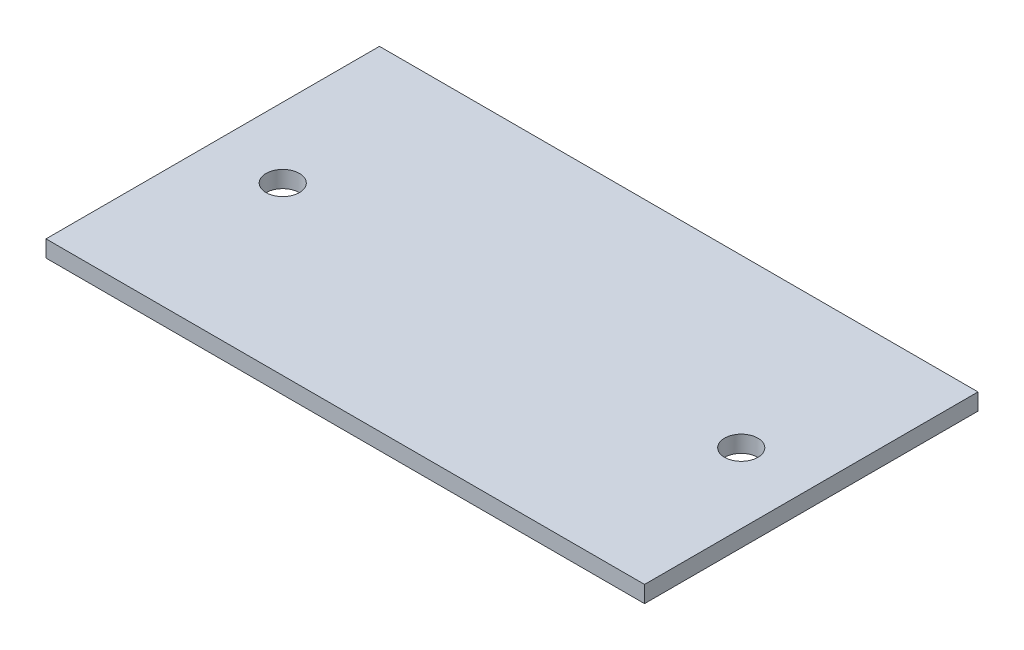
ISO-10303-21;
HEADER;
FILE_DESCRIPTION(('STEP AP214'),'2;1');
FILE_NAME('part.step','',(''),(''),'','','');
FILE_SCHEMA(('AUTOMOTIVE_DESIGN { 1 0 10303 214 1 1 1 1 }'));
ENDSEC;
DATA;
#1=APPLICATION_CONTEXT('core data for automotive mechanical design processes');
#2=APPLICATION_PROTOCOL_DEFINITION('international standard','automotive_design',2000,#1);
#3=PRODUCT_CONTEXT('',#1,'mechanical');
#4=PRODUCT('Part','Part','',(#3));
#5=PRODUCT_RELATED_PRODUCT_CATEGORY('part','',(#4));
#6=PRODUCT_DEFINITION_FORMATION('','',#4);
#7=PRODUCT_DEFINITION_CONTEXT('part definition',#1,'design');
#8=PRODUCT_DEFINITION('design','',#6,#7);
#9=PRODUCT_DEFINITION_SHAPE('','',#8);
#10=(LENGTH_UNIT() NAMED_UNIT(*) SI_UNIT(.MILLI.,.METRE.));
#11=(NAMED_UNIT(*) PLANE_ANGLE_UNIT() SI_UNIT($,.RADIAN.));
#12=(NAMED_UNIT(*) SI_UNIT($,.STERADIAN.) SOLID_ANGLE_UNIT());
#13=UNCERTAINTY_MEASURE_WITH_UNIT(LENGTH_MEASURE(1.E-05),#10,'distance_accuracy_value','');
#14=(GEOMETRIC_REPRESENTATION_CONTEXT(3) GLOBAL_UNCERTAINTY_ASSIGNED_CONTEXT((#13)) GLOBAL_UNIT_ASSIGNED_CONTEXT((#10,
#11,#12)) REPRESENTATION_CONTEXT('',''));
#15=CARTESIAN_POINT('',(0.,0.,0.));
#16=DIRECTION('',(0.,0.,1.));
#17=DIRECTION('',(1.,0.,0.));
#18=AXIS2_PLACEMENT_3D('',#15,#16,#17);
#19=CARTESIAN_POINT('',(17.95,1.,10.));
#20=DIRECTION('',(-1.,0.,0.));
#21=DIRECTION('',(0.,0.,1.));
#22=AXIS2_PLACEMENT_3D('',#19,#20,#21);
#23=PLANE('',#22);
#24=DIRECTION('',(0.,0.,-1.));
#25=VECTOR('',#24,1.);
#26=CARTESIAN_POINT('',(17.95,0.,10.));
#27=LINE('',#26,#25);
#28=CARTESIAN_POINT('',(17.95,0.,10.));
#29=VERTEX_POINT('',#28);
#30=CARTESIAN_POINT('',(17.95,0.,-10.));
#31=VERTEX_POINT('',#30);
#32=EDGE_CURVE('E98',#29,#31,#27,.T.);
#33=ORIENTED_EDGE('',*,*,#32,.T.);
#34=DIRECTION('',(0.,-1.,0.));
#35=VECTOR('',#34,1.);
#36=CARTESIAN_POINT('',(17.95,1.,-10.));
#37=LINE('',#36,#35);
#38=CARTESIAN_POINT('',(17.95,1.,-10.));
#39=VERTEX_POINT('',#38);
#40=EDGE_CURVE('E11',#39,#31,#37,.T.);
#41=ORIENTED_EDGE('',*,*,#40,.F.);
#42=DIRECTION('',(0.,0.,-1.));
#43=VECTOR('',#42,1.);
#44=CARTESIAN_POINT('',(17.95,1.,10.));
#45=LINE('',#44,#43);
#46=CARTESIAN_POINT('',(17.95,1.,10.));
#47=VERTEX_POINT('',#46);
#48=EDGE_CURVE('E86',#47,#39,#45,.T.);
#49=ORIENTED_EDGE('',*,*,#48,.F.);
#50=DIRECTION('',(0.,-1.,0.));
#51=VECTOR('',#50,1.);
#52=CARTESIAN_POINT('',(17.95,1.,10.));
#53=LINE('',#52,#51);
#54=EDGE_CURVE('E94',#47,#29,#53,.T.);
#55=ORIENTED_EDGE('',*,*,#54,.T.);
#56=EDGE_LOOP('',(#33,#41,#49,#55));
#57=FACE_BOUND('',#56,.T.);
#58=ADVANCED_FACE('F35',(#57),#23,.F.);
#59=CARTESIAN_POINT('',(-17.95,1.,-10.));
#60=DIRECTION('',(0.,0.,1.));
#61=DIRECTION('',(1.,0.,0.));
#62=AXIS2_PLACEMENT_3D('',#59,#60,#61);
#63=PLANE('',#62);
#64=DIRECTION('',(-1.,0.,0.));
#65=VECTOR('',#64,1.);
#66=CARTESIAN_POINT('',(-17.95,0.,-10.));
#67=LINE('',#66,#65);
#68=CARTESIAN_POINT('',(-17.95,0.,-10.));
#69=VERTEX_POINT('',#68);
#70=EDGE_CURVE('E90',#31,#69,#67,.T.);
#71=ORIENTED_EDGE('',*,*,#70,.T.);
#72=DIRECTION('',(0.,-1.,0.));
#73=VECTOR('',#72,1.);
#74=CARTESIAN_POINT('',(-17.95,1.,-10.));
#75=LINE('',#74,#73);
#76=CARTESIAN_POINT('',(-17.95,1.,-10.));
#77=VERTEX_POINT('',#76);
#78=EDGE_CURVE('E43',#77,#69,#75,.T.);
#79=ORIENTED_EDGE('',*,*,#78,.F.);
#80=DIRECTION('',(-1.,0.,0.));
#81=VECTOR('',#80,1.);
#82=CARTESIAN_POINT('',(-17.95,1.,-10.));
#83=LINE('',#82,#81);
#84=EDGE_CURVE('E81',#39,#77,#83,.T.);
#85=ORIENTED_EDGE('',*,*,#84,.F.);
#86=ORIENTED_EDGE('',*,*,#40,.T.);
#87=EDGE_LOOP('',(#71,#79,#85,#86));
#88=FACE_BOUND('',#87,.T.);
#89=ADVANCED_FACE('F89',(#88),#63,.F.);
#90=CARTESIAN_POINT('',(-17.95,1.,10.));
#91=DIRECTION('',(1.,0.,0.));
#92=DIRECTION('',(0.,0.,-1.));
#93=AXIS2_PLACEMENT_3D('',#90,#91,#92);
#94=PLANE('',#93);
#95=DIRECTION('',(0.,0.,1.));
#96=VECTOR('',#95,1.);
#97=CARTESIAN_POINT('',(-17.95,0.,10.));
#98=LINE('',#97,#96);
#99=CARTESIAN_POINT('',(-17.95,0.,10.));
#100=VERTEX_POINT('',#99);
#101=EDGE_CURVE('E68',#69,#100,#98,.T.);
#102=ORIENTED_EDGE('',*,*,#101,.T.);
#103=DIRECTION('',(0.,-1.,0.));
#104=VECTOR('',#103,1.);
#105=CARTESIAN_POINT('',(-17.95,1.,10.));
#106=LINE('',#105,#104);
#107=CARTESIAN_POINT('',(-17.95,1.,10.));
#108=VERTEX_POINT('',#107);
#109=EDGE_CURVE('E91',#108,#100,#106,.T.);
#110=ORIENTED_EDGE('',*,*,#109,.F.);
#111=DIRECTION('',(0.,0.,1.));
#112=VECTOR('',#111,1.);
#113=CARTESIAN_POINT('',(-17.95,1.,10.));
#114=LINE('',#113,#112);
#115=EDGE_CURVE('E84',#77,#108,#114,.T.);
#116=ORIENTED_EDGE('',*,*,#115,.F.);
#117=ORIENTED_EDGE('',*,*,#78,.T.);
#118=EDGE_LOOP('',(#102,#110,#116,#117));
#119=FACE_BOUND('',#118,.T.);
#120=ADVANCED_FACE('F92',(#119),#94,.F.);
#121=CARTESIAN_POINT('',(-17.95,1.,10.));
#122=DIRECTION('',(0.,0.,-1.));
#123=DIRECTION('',(-1.,0.,0.));
#124=AXIS2_PLACEMENT_3D('',#121,#122,#123);
#125=PLANE('',#124);
#126=DIRECTION('',(1.,0.,0.));
#127=VECTOR('',#126,1.);
#128=CARTESIAN_POINT('',(-17.95,0.,10.));
#129=LINE('',#128,#127);
#130=EDGE_CURVE('E74',#100,#29,#129,.T.);
#131=ORIENTED_EDGE('',*,*,#130,.T.);
#132=ORIENTED_EDGE('',*,*,#54,.F.);
#133=DIRECTION('',(1.,0.,0.));
#134=VECTOR('',#133,1.);
#135=CARTESIAN_POINT('',(-17.95,1.,10.));
#136=LINE('',#135,#134);
#137=EDGE_CURVE('E51',#108,#47,#136,.T.);
#138=ORIENTED_EDGE('',*,*,#137,.F.);
#139=ORIENTED_EDGE('',*,*,#109,.T.);
#140=EDGE_LOOP('',(#131,#132,#138,#139));
#141=FACE_BOUND('',#140,.T.);
#142=ADVANCED_FACE('F106',(#141),#125,.F.);
#143=CARTESIAN_POINT('',(0.,1.,0.));
#144=DIRECTION('',(0.,-1.,0.));
#145=DIRECTION('',(0.,0.,-1.));
#146=AXIS2_PLACEMENT_3D('',#143,#144,#145);
#147=PLANE('',#146);
#148=CARTESIAN_POINT('',(-13.75,1.,0.));
#149=DIRECTION('',(0.,1.,0.));
#150=DIRECTION('',(0.,0.,1.));
#151=AXIS2_PLACEMENT_3D('',#148,#149,#150);
#152=CIRCLE('',#151,1.);
#153=CARTESIAN_POINT('',(-13.75,1.,1.));
#154=VERTEX_POINT('',#153);
#155=EDGE_CURVE('E115',#154,#154,#152,.T.);
#156=ORIENTED_EDGE('',*,*,#155,.F.);
#157=EDGE_LOOP('',(#156));
#158=FACE_BOUND('',#157,.T.);
#159=CARTESIAN_POINT('',(13.75,1.,0.));
#160=DIRECTION('',(0.,1.,0.));
#161=DIRECTION('',(0.,0.,1.));
#162=AXIS2_PLACEMENT_3D('',#159,#160,#161);
#163=CIRCLE('',#162,1.);
#164=CARTESIAN_POINT('',(13.75,1.,1.));
#165=VERTEX_POINT('',#164);
#166=EDGE_CURVE('E101',#165,#165,#163,.T.);
#167=ORIENTED_EDGE('',*,*,#166,.F.);
#168=EDGE_LOOP('',(#167));
#169=FACE_BOUND('',#168,.T.);
#170=ORIENTED_EDGE('',*,*,#48,.T.);
#171=ORIENTED_EDGE('',*,*,#84,.T.);
#172=ORIENTED_EDGE('',*,*,#115,.T.);
#173=ORIENTED_EDGE('',*,*,#137,.T.);
#174=EDGE_LOOP('',(#170,#171,#172,#173));
#175=FACE_BOUND('',#174,.T.);
#176=ADVANCED_FACE('F82',(#158,#169,#175),#147,.F.);
#177=CARTESIAN_POINT('',(0.,0.,0.));
#178=DIRECTION('',(0.,-1.,0.));
#179=DIRECTION('',(0.,0.,-1.));
#180=AXIS2_PLACEMENT_3D('',#177,#178,#179);
#181=PLANE('',#180);
#182=CARTESIAN_POINT('',(-13.75,0.,0.));
#183=DIRECTION('',(0.,-1.,0.));
#184=DIRECTION('',(0.,0.,-1.));
#185=AXIS2_PLACEMENT_3D('',#182,#183,#184);
#186=CIRCLE('',#185,1.);
#187=CARTESIAN_POINT('',(-13.75,0.,-1.));
#188=VERTEX_POINT('',#187);
#189=EDGE_CURVE('E118',#188,#188,#186,.F.);
#190=ORIENTED_EDGE('',*,*,#189,.T.);
#191=EDGE_LOOP('',(#190));
#192=FACE_BOUND('',#191,.T.);
#193=CARTESIAN_POINT('',(13.75,0.,0.));
#194=DIRECTION('',(0.,-1.,0.));
#195=DIRECTION('',(0.,0.,-1.));
#196=AXIS2_PLACEMENT_3D('',#193,#194,#195);
#197=CIRCLE('',#196,1.);
#198=CARTESIAN_POINT('',(13.75,0.,-1.));
#199=VERTEX_POINT('',#198);
#200=EDGE_CURVE('E112',#199,#199,#197,.F.);
#201=ORIENTED_EDGE('',*,*,#200,.T.);
#202=EDGE_LOOP('',(#201));
#203=FACE_BOUND('',#202,.T.);
#204=ORIENTED_EDGE('',*,*,#32,.F.);
#205=ORIENTED_EDGE('',*,*,#130,.F.);
#206=ORIENTED_EDGE('',*,*,#101,.F.);
#207=ORIENTED_EDGE('',*,*,#70,.F.);
#208=EDGE_LOOP('',(#204,#205,#206,#207));
#209=FACE_BOUND('',#208,.T.);
#210=ADVANCED_FACE('F109',(#192,#203,#209),#181,.T.);
#211=CARTESIAN_POINT('',(13.75,-0.000999999999999916,0.));
#212=DIRECTION('',(0.,1.,0.));
#213=DIRECTION('',(0.,0.,1.));
#214=AXIS2_PLACEMENT_3D('',#211,#212,#213);
#215=CYLINDRICAL_SURFACE('',#214,1.);
#216=ORIENTED_EDGE('',*,*,#200,.F.);
#217=EDGE_LOOP('',(#216));
#218=FACE_BOUND('',#217,.T.);
#219=ORIENTED_EDGE('',*,*,#166,.T.);
#220=EDGE_LOOP('',(#219));
#221=FACE_BOUND('',#220,.T.);
#222=ADVANCED_FACE('F131',(#218,#221),#215,.F.);
#223=CARTESIAN_POINT('',(-13.75,-0.000999999999999916,0.));
#224=DIRECTION('',(0.,1.,0.));
#225=DIRECTION('',(0.,0.,1.));
#226=AXIS2_PLACEMENT_3D('',#223,#224,#225);
#227=CYLINDRICAL_SURFACE('',#226,1.);
#228=ORIENTED_EDGE('',*,*,#189,.F.);
#229=EDGE_LOOP('',(#228));
#230=FACE_BOUND('',#229,.T.);
#231=ORIENTED_EDGE('',*,*,#155,.T.);
#232=EDGE_LOOP('',(#231));
#233=FACE_BOUND('',#232,.T.);
#234=ADVANCED_FACE('F124',(#230,#233),#227,.F.);
#235=CLOSED_SHELL('',(#58,#89,#120,#142,#176,#210,#222,#234));
#236=MANIFOLD_SOLID_BREP('B2',#235);
#237=ADVANCED_BREP_SHAPE_REPRESENTATION('',(#18,#236),#14);
#238=SHAPE_DEFINITION_REPRESENTATION(#9,#237);
ENDSEC;
END-ISO-10303-21;
